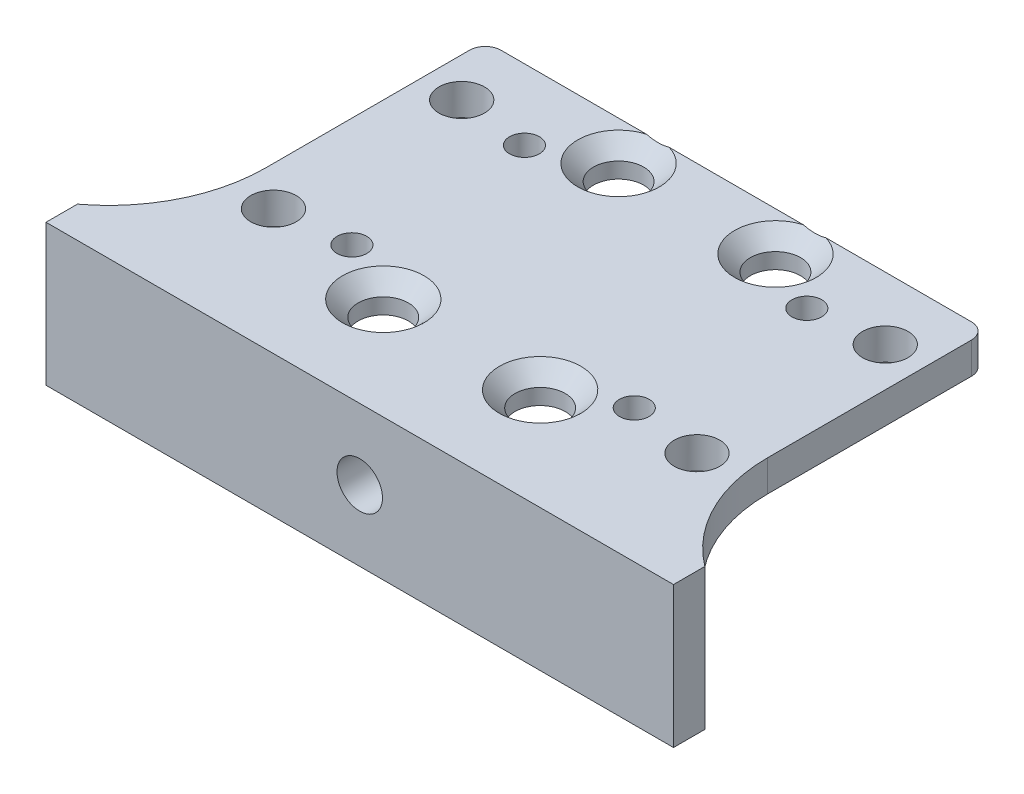
ISO-10303-21;
HEADER;
FILE_DESCRIPTION(('STEP AP214'),'2;1');
FILE_NAME('part.step','',(''),(''),'','','');
FILE_SCHEMA(('AUTOMOTIVE_DESIGN { 1 0 10303 214 1 1 1 1 }'));
ENDSEC;
DATA;
#1=APPLICATION_CONTEXT('core data for automotive mechanical design processes');
#2=APPLICATION_PROTOCOL_DEFINITION('international standard','automotive_design',2000,#1);
#3=PRODUCT_CONTEXT('',#1,'mechanical');
#4=PRODUCT('Part','Part','',(#3));
#5=PRODUCT_RELATED_PRODUCT_CATEGORY('part','',(#4));
#6=PRODUCT_DEFINITION_FORMATION('','',#4);
#7=PRODUCT_DEFINITION_CONTEXT('part definition',#1,'design');
#8=PRODUCT_DEFINITION('design','',#6,#7);
#9=PRODUCT_DEFINITION_SHAPE('','',#8);
#10=(LENGTH_UNIT() NAMED_UNIT(*) SI_UNIT(.MILLI.,.METRE.));
#11=(NAMED_UNIT(*) PLANE_ANGLE_UNIT() SI_UNIT($,.RADIAN.));
#12=(NAMED_UNIT(*) SI_UNIT($,.STERADIAN.) SOLID_ANGLE_UNIT());
#13=UNCERTAINTY_MEASURE_WITH_UNIT(LENGTH_MEASURE(1.E-05),#10,'distance_accuracy_value','');
#14=(GEOMETRIC_REPRESENTATION_CONTEXT(3) GLOBAL_UNCERTAINTY_ASSIGNED_CONTEXT((#13)) GLOBAL_UNIT_ASSIGNED_CONTEXT((#10,
#11,#12)) REPRESENTATION_CONTEXT('',''));
#15=CARTESIAN_POINT('',(0.,0.,0.));
#16=DIRECTION('',(0.,0.,1.));
#17=DIRECTION('',(1.,0.,0.));
#18=AXIS2_PLACEMENT_3D('',#15,#16,#17);
#19=CARTESIAN_POINT('',(-20.,2.,14.));
#20=DIRECTION('',(1.,0.,0.));
#21=DIRECTION('',(0.,0.,-1.));
#22=AXIS2_PLACEMENT_3D('',#19,#20,#21);
#23=PLANE('',#22);
#24=DIRECTION('',(0.,1.,0.));
#25=VECTOR('',#24,1.);
#26=CARTESIAN_POINT('',(-20.,-7.,12.));
#27=LINE('',#26,#25);
#28=CARTESIAN_POINT('',(-20.,-7.,12.));
#29=VERTEX_POINT('',#28);
#30=CARTESIAN_POINT('',(-20.,0.,12.));
#31=VERTEX_POINT('',#30);
#32=EDGE_CURVE('E800',#29,#31,#27,.T.);
#33=ORIENTED_EDGE('',*,*,#32,.F.);
#34=DIRECTION('',(0.,0.,-1.));
#35=VECTOR('',#34,1.);
#36=CARTESIAN_POINT('',(-20.,-7.,14.));
#37=LINE('',#36,#35);
#38=CARTESIAN_POINT('',(-20.,-7.,14.));
#39=VERTEX_POINT('',#38);
#40=EDGE_CURVE('E188',#39,#29,#37,.T.);
#41=ORIENTED_EDGE('',*,*,#40,.F.);
#42=DIRECTION('',(0.,-1.,0.));
#43=VECTOR('',#42,1.);
#44=CARTESIAN_POINT('',(-20.,2.,14.));
#45=LINE('',#44,#43);
#46=CARTESIAN_POINT('',(-20.,2.,14.));
#47=VERTEX_POINT('',#46);
#48=EDGE_CURVE('E847',#47,#39,#45,.T.);
#49=ORIENTED_EDGE('',*,*,#48,.F.);
#50=DIRECTION('',(0.,0.,-1.));
#51=VECTOR('',#50,1.);
#52=CARTESIAN_POINT('',(-20.,2.,14.));
#53=LINE('',#52,#51);
#54=CARTESIAN_POINT('',(-20.,2.,12.));
#55=VERTEX_POINT('',#54);
#56=EDGE_CURVE('E203',#47,#55,#53,.T.);
#57=ORIENTED_EDGE('',*,*,#56,.T.);
#58=EDGE_CURVE('E190',#31,#55,#27,.T.);
#59=ORIENTED_EDGE('',*,*,#58,.F.);
#60=EDGE_LOOP('',(#33,#41,#49,#57,#59));
#61=FACE_BOUND('',#60,.T.);
#62=ADVANCED_FACE('F41',(#61),#23,.F.);
#63=CARTESIAN_POINT('',(-20.,-7.,14.));
#64=DIRECTION('',(0.,1.,0.));
#65=DIRECTION('',(0.,0.,1.));
#66=AXIS2_PLACEMENT_3D('',#63,#64,#65);
#67=PLANE('',#66);
#68=DIRECTION('',(-1.,0.,0.));
#69=VECTOR('',#68,1.);
#70=CARTESIAN_POINT('',(20.,-7.,12.));
#71=LINE('',#70,#69);
#72=CARTESIAN_POINT('',(20.,-7.,12.));
#73=VERTEX_POINT('',#72);
#74=EDGE_CURVE('E167',#73,#29,#71,.T.);
#75=ORIENTED_EDGE('',*,*,#74,.F.);
#76=DIRECTION('',(0.,0.,-1.));
#77=VECTOR('',#76,1.);
#78=CARTESIAN_POINT('',(20.,-7.,14.));
#79=LINE('',#78,#77);
#80=CARTESIAN_POINT('',(20.,-7.,14.));
#81=VERTEX_POINT('',#80);
#82=EDGE_CURVE('E185',#81,#73,#79,.T.);
#83=ORIENTED_EDGE('',*,*,#82,.F.);
#84=DIRECTION('',(1.,0.,0.));
#85=VECTOR('',#84,1.);
#86=CARTESIAN_POINT('',(-20.,-7.,14.));
#87=LINE('',#86,#85);
#88=EDGE_CURVE('E854',#39,#81,#87,.T.);
#89=ORIENTED_EDGE('',*,*,#88,.F.);
#90=ORIENTED_EDGE('',*,*,#40,.T.);
#91=EDGE_LOOP('',(#75,#83,#89,#90));
#92=FACE_BOUND('',#91,.T.);
#93=ADVANCED_FACE('F184',(#92),#67,.F.);
#94=CARTESIAN_POINT('',(20.,2.,14.));
#95=DIRECTION('',(-1.,0.,0.));
#96=DIRECTION('',(0.,0.,1.));
#97=AXIS2_PLACEMENT_3D('',#94,#95,#96);
#98=PLANE('',#97);
#99=DIRECTION('',(0.,-1.,0.));
#100=VECTOR('',#99,1.);
#101=CARTESIAN_POINT('',(20.,2.,12.));
#102=LINE('',#101,#100);
#103=CARTESIAN_POINT('',(20.,2.,12.));
#104=VERTEX_POINT('',#103);
#105=CARTESIAN_POINT('',(20.,0.,12.));
#106=VERTEX_POINT('',#105);
#107=EDGE_CURVE('E178',#104,#106,#102,.T.);
#108=ORIENTED_EDGE('',*,*,#107,.F.);
#109=DIRECTION('',(0.,0.,-1.));
#110=VECTOR('',#109,1.);
#111=CARTESIAN_POINT('',(20.,2.,14.));
#112=LINE('',#111,#110);
#113=CARTESIAN_POINT('',(20.,2.,14.));
#114=VERTEX_POINT('',#113);
#115=EDGE_CURVE('E196',#114,#104,#112,.T.);
#116=ORIENTED_EDGE('',*,*,#115,.F.);
#117=DIRECTION('',(0.,1.,0.));
#118=VECTOR('',#117,1.);
#119=CARTESIAN_POINT('',(20.,2.,14.));
#120=LINE('',#119,#118);
#121=EDGE_CURVE('E194',#81,#114,#120,.T.);
#122=ORIENTED_EDGE('',*,*,#121,.F.);
#123=ORIENTED_EDGE('',*,*,#82,.T.);
#124=EDGE_CURVE('E163',#106,#73,#102,.T.);
#125=ORIENTED_EDGE('',*,*,#124,.F.);
#126=EDGE_LOOP('',(#108,#116,#122,#123,#125));
#127=FACE_BOUND('',#126,.T.);
#128=ADVANCED_FACE('F192',(#127),#98,.F.);
#129=CARTESIAN_POINT('',(0.,2.,0.));
#130=DIRECTION('',(0.,-1.,0.));
#131=DIRECTION('',(0.,0.,-1.));
#132=AXIS2_PLACEMENT_3D('',#129,#130,#131);
#133=PLANE('',#132);
#134=CARTESIAN_POINT('',(-13.5,2.,6.));
#135=DIRECTION('',(0.,1.,0.));
#136=DIRECTION('',(0.,0.,1.));
#137=AXIS2_PLACEMENT_3D('',#134,#135,#136);
#138=CIRCLE('',#137,1.45);
#139=CARTESIAN_POINT('',(-13.5,2.,7.45));
#140=VERTEX_POINT('',#139);
#141=EDGE_CURVE('E767',#140,#140,#138,.T.);
#142=ORIENTED_EDGE('',*,*,#141,.F.);
#143=EDGE_LOOP('',(#142));
#144=FACE_BOUND('',#143,.T.);
#145=CARTESIAN_POINT('',(13.5,2.,6.));
#146=DIRECTION('',(0.,1.,0.));
#147=DIRECTION('',(0.,0.,1.));
#148=AXIS2_PLACEMENT_3D('',#145,#146,#147);
#149=CIRCLE('',#148,1.45);
#150=CARTESIAN_POINT('',(13.5,2.,7.45));
#151=VERTEX_POINT('',#150);
#152=EDGE_CURVE('E773',#151,#151,#149,.T.);
#153=ORIENTED_EDGE('',*,*,#152,.F.);
#154=EDGE_LOOP('',(#153));
#155=FACE_BOUND('',#154,.T.);
#156=CARTESIAN_POINT('',(13.5,2.,-6.));
#157=DIRECTION('',(0.,1.,0.));
#158=DIRECTION('',(0.,0.,1.));
#159=AXIS2_PLACEMENT_3D('',#156,#157,#158);
#160=CIRCLE('',#159,1.45);
#161=CARTESIAN_POINT('',(13.5,2.,-4.55));
#162=VERTEX_POINT('',#161);
#163=EDGE_CURVE('E779',#162,#162,#160,.T.);
#164=ORIENTED_EDGE('',*,*,#163,.F.);
#165=EDGE_LOOP('',(#164));
#166=FACE_BOUND('',#165,.T.);
#167=CARTESIAN_POINT('',(-9.,2.,-5.5));
#168=DIRECTION('',(0.,1.,0.));
#169=DIRECTION('',(0.,0.,1.));
#170=AXIS2_PLACEMENT_3D('',#167,#168,#169);
#171=CIRCLE('',#170,0.949999999999999);
#172=CARTESIAN_POINT('',(-9.,2.,-4.55));
#173=VERTEX_POINT('',#172);
#174=EDGE_CURVE('E785',#173,#173,#171,.T.);
#175=ORIENTED_EDGE('',*,*,#174,.F.);
#176=EDGE_LOOP('',(#175));
#177=FACE_BOUND('',#176,.T.);
#178=CARTESIAN_POINT('',(9.,2.,-5.5));
#179=DIRECTION('',(0.,1.,0.));
#180=DIRECTION('',(0.,0.,1.));
#181=AXIS2_PLACEMENT_3D('',#178,#179,#180);
#182=CIRCLE('',#181,0.949999999999999);
#183=CARTESIAN_POINT('',(9.,2.,-4.55));
#184=VERTEX_POINT('',#183);
#185=EDGE_CURVE('E791',#184,#184,#182,.T.);
#186=ORIENTED_EDGE('',*,*,#185,.F.);
#187=EDGE_LOOP('',(#186));
#188=FACE_BOUND('',#187,.T.);
#189=CARTESIAN_POINT('',(9.,2.,5.5));
#190=DIRECTION('',(0.,1.,0.));
#191=DIRECTION('',(0.,0.,1.));
#192=AXIS2_PLACEMENT_3D('',#189,#190,#191);
#193=CIRCLE('',#192,0.949999999999999);
#194=CARTESIAN_POINT('',(9.,2.,6.45));
#195=VERTEX_POINT('',#194);
#196=EDGE_CURVE('E762',#195,#195,#193,.T.);
#197=ORIENTED_EDGE('',*,*,#196,.F.);
#198=EDGE_LOOP('',(#197));
#199=FACE_BOUND('',#198,.T.);
#200=CARTESIAN_POINT('',(-9.,2.,5.5));
#201=DIRECTION('',(0.,1.,0.));
#202=DIRECTION('',(0.,0.,1.));
#203=AXIS2_PLACEMENT_3D('',#200,#201,#202);
#204=CIRCLE('',#203,0.949999999999999);
#205=CARTESIAN_POINT('',(-9.,2.,6.45));
#206=VERTEX_POINT('',#205);
#207=EDGE_CURVE('E756',#206,#206,#204,.T.);
#208=ORIENTED_EDGE('',*,*,#207,.F.);
#209=EDGE_LOOP('',(#208));
#210=FACE_BOUND('',#209,.T.);
#211=CARTESIAN_POINT('',(-13.5,2.,-6.));
#212=DIRECTION('',(0.,1.,0.));
#213=DIRECTION('',(0.,0.,1.));
#214=AXIS2_PLACEMENT_3D('',#211,#212,#213);
#215=CIRCLE('',#214,1.45);
#216=CARTESIAN_POINT('',(-13.5,2.,-4.55));
#217=VERTEX_POINT('',#216);
#218=EDGE_CURVE('E792',#217,#217,#215,.T.);
#219=ORIENTED_EDGE('',*,*,#218,.F.);
#220=EDGE_LOOP('',(#219));
#221=FACE_BOUND('',#220,.T.);
#222=CARTESIAN_POINT('',(-5.,2.,7.5));
#223=DIRECTION('',(0.,-1.,0.));
#224=DIRECTION('',(0.,0.,-1.));
#225=AXIS2_PLACEMENT_3D('',#222,#223,#224);
#226=CIRCLE('',#225,2.60000000000002);
#227=CARTESIAN_POINT('',(-5.,2.,4.89999999999998));
#228=VERTEX_POINT('',#227);
#229=EDGE_CURVE('E283',#228,#228,#226,.T.);
#230=ORIENTED_EDGE('',*,*,#229,.T.);
#231=EDGE_LOOP('',(#230));
#232=FACE_BOUND('',#231,.T.);
#233=CARTESIAN_POINT('',(5.,2.,7.5));
#234=DIRECTION('',(0.,-1.,0.));
#235=DIRECTION('',(0.,0.,-1.));
#236=AXIS2_PLACEMENT_3D('',#233,#234,#235);
#237=CIRCLE('',#236,2.60000000000002);
#238=CARTESIAN_POINT('',(5.,2.,4.89999999999998));
#239=VERTEX_POINT('',#238);
#240=EDGE_CURVE('E279',#239,#239,#237,.T.);
#241=ORIENTED_EDGE('',*,*,#240,.T.);
#242=EDGE_LOOP('',(#241));
#243=FACE_BOUND('',#242,.T.);
#244=DIRECTION('',(0.,0.,-1.));
#245=VECTOR('',#244,1.);
#246=CARTESIAN_POINT('',(16.,2.,10.));
#247=LINE('',#246,#245);
#248=CARTESIAN_POINT('',(16.,2.,4.));
#249=VERTEX_POINT('',#248);
#250=CARTESIAN_POINT('',(16.,2.,-9.));
#251=VERTEX_POINT('',#250);
#252=EDGE_CURVE('E223',#249,#251,#247,.T.);
#253=ORIENTED_EDGE('',*,*,#252,.T.);
#254=CARTESIAN_POINT('',(15.,2.,-9.));
#255=DIRECTION('',(0.,-1.,0.));
#256=DIRECTION('',(0.,0.,-1.));
#257=AXIS2_PLACEMENT_3D('',#254,#255,#256);
#258=CIRCLE('',#257,1.);
#259=CARTESIAN_POINT('',(15.,2.,-10.));
#260=VERTEX_POINT('',#259);
#261=EDGE_CURVE('E50',#251,#260,#258,.F.);
#262=ORIENTED_EDGE('',*,*,#261,.T.);
#263=DIRECTION('',(-1.,0.,0.));
#264=VECTOR('',#263,1.);
#265=CARTESIAN_POINT('',(-16.,2.,-10.));
#266=LINE('',#265,#264);
#267=CARTESIAN_POINT('',(5.71414284285432,2.,-10.));
#268=VERTEX_POINT('',#267);
#269=EDGE_CURVE('E228',#260,#268,#266,.T.);
#270=ORIENTED_EDGE('',*,*,#269,.T.);
#271=CARTESIAN_POINT('',(5.,2.,-7.5));
#272=DIRECTION('',(0.,-1.,0.));
#273=DIRECTION('',(0.,0.,-1.));
#274=AXIS2_PLACEMENT_3D('',#271,#272,#273);
#275=CIRCLE('',#274,2.60000000000001);
#276=CARTESIAN_POINT('',(4.28585715714569,2.,-10.));
#277=VERTEX_POINT('',#276);
#278=EDGE_CURVE('E275',#268,#277,#275,.T.);
#279=ORIENTED_EDGE('',*,*,#278,.T.);
#280=CARTESIAN_POINT('',(-4.28585715714569,2.,-10.));
#281=VERTEX_POINT('',#280);
#282=EDGE_CURVE('E232',#277,#281,#266,.T.);
#283=ORIENTED_EDGE('',*,*,#282,.T.);
#284=CARTESIAN_POINT('',(-5.,2.,-7.5));
#285=DIRECTION('',(0.,-1.,0.));
#286=DIRECTION('',(0.,0.,-1.));
#287=AXIS2_PLACEMENT_3D('',#284,#285,#286);
#288=CIRCLE('',#287,2.60000000000001);
#289=CARTESIAN_POINT('',(-5.71414284285431,2.,-10.));
#290=VERTEX_POINT('',#289);
#291=EDGE_CURVE('E271',#281,#290,#288,.T.);
#292=ORIENTED_EDGE('',*,*,#291,.T.);
#293=CARTESIAN_POINT('',(-15.,2.,-10.));
#294=VERTEX_POINT('',#293);
#295=EDGE_CURVE('E226',#290,#294,#266,.T.);
#296=ORIENTED_EDGE('',*,*,#295,.T.);
#297=CARTESIAN_POINT('',(-15.,2.,-9.));
#298=DIRECTION('',(0.,-1.,0.));
#299=DIRECTION('',(0.,0.,-1.));
#300=AXIS2_PLACEMENT_3D('',#297,#298,#299);
#301=CIRCLE('',#300,1.);
#302=CARTESIAN_POINT('',(-16.,2.,-9.));
#303=VERTEX_POINT('',#302);
#304=EDGE_CURVE('E57',#294,#303,#301,.F.);
#305=ORIENTED_EDGE('',*,*,#304,.T.);
#306=DIRECTION('',(0.,0.,1.));
#307=VECTOR('',#306,1.);
#308=CARTESIAN_POINT('',(-16.,2.,10.));
#309=LINE('',#308,#307);
#310=CARTESIAN_POINT('',(-16.,2.,4.));
#311=VERTEX_POINT('',#310);
#312=EDGE_CURVE('E231',#303,#311,#309,.T.);
#313=ORIENTED_EDGE('',*,*,#312,.T.);
#314=CARTESIAN_POINT('',(-26.,2.,4.));
#315=DIRECTION('',(0.,-1.,0.));
#316=DIRECTION('',(0.,0.,-1.));
#317=AXIS2_PLACEMENT_3D('',#314,#315,#316);
#318=CIRCLE('',#317,10.);
#319=EDGE_CURVE('E264',#311,#55,#318,.T.);
#320=ORIENTED_EDGE('',*,*,#319,.T.);
#321=ORIENTED_EDGE('',*,*,#56,.F.);
#322=DIRECTION('',(-1.,0.,0.));
#323=VECTOR('',#322,1.);
#324=CARTESIAN_POINT('',(-20.,2.,14.));
#325=LINE('',#324,#323);
#326=EDGE_CURVE('E859',#114,#47,#325,.T.);
#327=ORIENTED_EDGE('',*,*,#326,.F.);
#328=ORIENTED_EDGE('',*,*,#115,.T.);
#329=CARTESIAN_POINT('',(26.,2.,4.));
#330=DIRECTION('',(0.,-1.,0.));
#331=DIRECTION('',(0.,0.,-1.));
#332=AXIS2_PLACEMENT_3D('',#329,#330,#331);
#333=CIRCLE('',#332,10.);
#334=EDGE_CURVE('E254',#104,#249,#333,.T.);
#335=ORIENTED_EDGE('',*,*,#334,.T.);
#336=EDGE_LOOP('',(#253,#262,#270,#279,#283,#292,#296,#305,#313,#320,#321,#327,#328,#335));
#337=FACE_BOUND('',#336,.T.);
#338=ADVANCED_FACE('F387',(#144,#155,#166,#177,#188,#199,#210,#221,#232,#243,#337),#133,.F.);
#339=CARTESIAN_POINT('',(0.,0.,0.));
#340=DIRECTION('',(0.,-1.,0.));
#341=DIRECTION('',(0.,0.,-1.));
#342=AXIS2_PLACEMENT_3D('',#339,#340,#341);
#343=PLANE('',#342);
#344=CARTESIAN_POINT('',(-13.5,0.,6.));
#345=DIRECTION('',(0.,-1.,0.));
#346=DIRECTION('',(0.,0.,-1.));
#347=AXIS2_PLACEMENT_3D('',#344,#345,#346);
#348=CIRCLE('',#347,1.45);
#349=CARTESIAN_POINT('',(-13.5,0.,4.55));
#350=VERTEX_POINT('',#349);
#351=EDGE_CURVE('E397',#350,#350,#348,.F.);
#352=ORIENTED_EDGE('',*,*,#351,.T.);
#353=EDGE_LOOP('',(#352));
#354=FACE_BOUND('',#353,.T.);
#355=CARTESIAN_POINT('',(13.5,0.,6.));
#356=DIRECTION('',(0.,-1.,0.));
#357=DIRECTION('',(0.,0.,-1.));
#358=AXIS2_PLACEMENT_3D('',#355,#356,#357);
#359=CIRCLE('',#358,1.45);
#360=CARTESIAN_POINT('',(13.5,0.,4.55));
#361=VERTEX_POINT('',#360);
#362=EDGE_CURVE('E401',#361,#361,#359,.F.);
#363=ORIENTED_EDGE('',*,*,#362,.T.);
#364=EDGE_LOOP('',(#363));
#365=FACE_BOUND('',#364,.T.);
#366=CARTESIAN_POINT('',(13.5,0.,-6.));
#367=DIRECTION('',(0.,-1.,0.));
#368=DIRECTION('',(0.,0.,-1.));
#369=AXIS2_PLACEMENT_3D('',#366,#367,#368);
#370=CIRCLE('',#369,1.45);
#371=CARTESIAN_POINT('',(13.5,0.,-7.45));
#372=VERTEX_POINT('',#371);
#373=EDGE_CURVE('E405',#372,#372,#370,.F.);
#374=ORIENTED_EDGE('',*,*,#373,.T.);
#375=EDGE_LOOP('',(#374));
#376=FACE_BOUND('',#375,.T.);
#377=CARTESIAN_POINT('',(-9.,0.,-5.5));
#378=DIRECTION('',(0.,-1.,0.));
#379=DIRECTION('',(0.,0.,-1.));
#380=AXIS2_PLACEMENT_3D('',#377,#378,#379);
#381=CIRCLE('',#380,0.949999999999999);
#382=CARTESIAN_POINT('',(-9.,0.,-6.45));
#383=VERTEX_POINT('',#382);
#384=EDGE_CURVE('E409',#383,#383,#381,.F.);
#385=ORIENTED_EDGE('',*,*,#384,.T.);
#386=EDGE_LOOP('',(#385));
#387=FACE_BOUND('',#386,.T.);
#388=CARTESIAN_POINT('',(9.,0.,-5.5));
#389=DIRECTION('',(0.,-1.,0.));
#390=DIRECTION('',(0.,0.,-1.));
#391=AXIS2_PLACEMENT_3D('',#388,#389,#390);
#392=CIRCLE('',#391,0.949999999999999);
#393=CARTESIAN_POINT('',(9.,0.,-6.45));
#394=VERTEX_POINT('',#393);
#395=EDGE_CURVE('E413',#394,#394,#392,.F.);
#396=ORIENTED_EDGE('',*,*,#395,.T.);
#397=EDGE_LOOP('',(#396));
#398=FACE_BOUND('',#397,.T.);
#399=CARTESIAN_POINT('',(9.,0.,5.5));
#400=DIRECTION('',(0.,-1.,0.));
#401=DIRECTION('',(0.,0.,-1.));
#402=AXIS2_PLACEMENT_3D('',#399,#400,#401);
#403=CIRCLE('',#402,0.949999999999999);
#404=CARTESIAN_POINT('',(9.,0.,4.55));
#405=VERTEX_POINT('',#404);
#406=EDGE_CURVE('E417',#405,#405,#403,.F.);
#407=ORIENTED_EDGE('',*,*,#406,.T.);
#408=EDGE_LOOP('',(#407));
#409=FACE_BOUND('',#408,.T.);
#410=CARTESIAN_POINT('',(-9.,0.,5.5));
#411=DIRECTION('',(0.,-1.,0.));
#412=DIRECTION('',(0.,0.,-1.));
#413=AXIS2_PLACEMENT_3D('',#410,#411,#412);
#414=CIRCLE('',#413,0.949999999999999);
#415=CARTESIAN_POINT('',(-9.,0.,4.55));
#416=VERTEX_POINT('',#415);
#417=EDGE_CURVE('E421',#416,#416,#414,.F.);
#418=ORIENTED_EDGE('',*,*,#417,.T.);
#419=EDGE_LOOP('',(#418));
#420=FACE_BOUND('',#419,.T.);
#421=CARTESIAN_POINT('',(-13.5,0.,-6.));
#422=DIRECTION('',(0.,-1.,0.));
#423=DIRECTION('',(0.,0.,-1.));
#424=AXIS2_PLACEMENT_3D('',#421,#422,#423);
#425=CIRCLE('',#424,1.45);
#426=CARTESIAN_POINT('',(-13.5,0.,-7.45));
#427=VERTEX_POINT('',#426);
#428=EDGE_CURVE('E425',#427,#427,#425,.F.);
#429=ORIENTED_EDGE('',*,*,#428,.T.);
#430=EDGE_LOOP('',(#429));
#431=FACE_BOUND('',#430,.T.);
#432=CARTESIAN_POINT('',(-5.,0.,7.5));
#433=DIRECTION('',(0.,1.,0.));
#434=DIRECTION('',(0.,0.,1.));
#435=AXIS2_PLACEMENT_3D('',#432,#433,#434);
#436=CIRCLE('',#435,1.6);
#437=CARTESIAN_POINT('',(-5.,0.,9.1));
#438=VERTEX_POINT('',#437);
#439=EDGE_CURVE('E210',#438,#438,#436,.T.);
#440=ORIENTED_EDGE('',*,*,#439,.T.);
#441=EDGE_LOOP('',(#440));
#442=FACE_BOUND('',#441,.T.);
#443=CARTESIAN_POINT('',(-5.,0.,-7.5));
#444=DIRECTION('',(0.,1.,0.));
#445=DIRECTION('',(0.,0.,1.));
#446=AXIS2_PLACEMENT_3D('',#443,#444,#445);
#447=CIRCLE('',#446,1.6);
#448=CARTESIAN_POINT('',(-5.,0.,-5.9));
#449=VERTEX_POINT('',#448);
#450=EDGE_CURVE('E218',#449,#449,#447,.T.);
#451=ORIENTED_EDGE('',*,*,#450,.T.);
#452=EDGE_LOOP('',(#451));
#453=FACE_BOUND('',#452,.T.);
#454=DIRECTION('',(-1.,0.,0.));
#455=VECTOR('',#454,1.);
#456=CARTESIAN_POINT('',(-16.,0.,-10.));
#457=LINE('',#456,#455);
#458=CARTESIAN_POINT('',(15.,0.,-10.));
#459=VERTEX_POINT('',#458);
#460=CARTESIAN_POINT('',(-15.,0.,-10.));
#461=VERTEX_POINT('',#460);
#462=EDGE_CURVE('E238',#459,#461,#457,.T.);
#463=ORIENTED_EDGE('',*,*,#462,.F.);
#464=CARTESIAN_POINT('',(15.,0.,-9.));
#465=DIRECTION('',(0.,-1.,0.));
#466=DIRECTION('',(0.,0.,-1.));
#467=AXIS2_PLACEMENT_3D('',#464,#465,#466);
#468=CIRCLE('',#467,1.);
#469=CARTESIAN_POINT('',(16.,0.,-9.));
#470=VERTEX_POINT('',#469);
#471=EDGE_CURVE('E438',#459,#470,#468,.T.);
#472=ORIENTED_EDGE('',*,*,#471,.T.);
#473=DIRECTION('',(0.,0.,-1.));
#474=VECTOR('',#473,1.);
#475=CARTESIAN_POINT('',(16.,0.,10.));
#476=LINE('',#475,#474);
#477=CARTESIAN_POINT('',(16.,0.,4.));
#478=VERTEX_POINT('',#477);
#479=EDGE_CURVE('E222',#478,#470,#476,.T.);
#480=ORIENTED_EDGE('',*,*,#479,.F.);
#481=CARTESIAN_POINT('',(26.,0.,4.));
#482=DIRECTION('',(0.,-1.,0.));
#483=DIRECTION('',(0.,0.,-1.));
#484=AXIS2_PLACEMENT_3D('',#481,#482,#483);
#485=CIRCLE('',#484,10.);
#486=EDGE_CURVE('E257',#478,#106,#485,.F.);
#487=ORIENTED_EDGE('',*,*,#486,.T.);
#488=DIRECTION('',(1.,0.,0.));
#489=VECTOR('',#488,1.);
#490=CARTESIAN_POINT('',(16.,0.,12.));
#491=LINE('',#490,#489);
#492=CARTESIAN_POINT('',(4.,0.,12.));
#493=VERTEX_POINT('',#492);
#494=EDGE_CURVE('E171',#493,#106,#491,.T.);
#495=ORIENTED_EDGE('',*,*,#494,.F.);
#496=DIRECTION('',(0.,0.,-1.));
#497=VECTOR('',#496,1.);
#498=CARTESIAN_POINT('',(4.,0.,12.));
#499=LINE('',#498,#497);
#500=CARTESIAN_POINT('',(4.,0.,10.));
#501=VERTEX_POINT('',#500);
#502=EDGE_CURVE('E831',#493,#501,#499,.T.);
#503=ORIENTED_EDGE('',*,*,#502,.T.);
#504=DIRECTION('',(1.,0.,0.));
#505=VECTOR('',#504,1.);
#506=CARTESIAN_POINT('',(-16.,0.,10.));
#507=LINE('',#506,#505);
#508=CARTESIAN_POINT('',(-4.,0.,10.));
#509=VERTEX_POINT('',#508);
#510=EDGE_CURVE('E227',#509,#501,#507,.T.);
#511=ORIENTED_EDGE('',*,*,#510,.F.);
#512=DIRECTION('',(0.,0.,-1.));
#513=VECTOR('',#512,1.);
#514=CARTESIAN_POINT('',(-4.,0.,12.));
#515=LINE('',#514,#513);
#516=CARTESIAN_POINT('',(-4.,0.,12.));
#517=VERTEX_POINT('',#516);
#518=EDGE_CURVE('E820',#517,#509,#515,.T.);
#519=ORIENTED_EDGE('',*,*,#518,.F.);
#520=DIRECTION('',(1.,0.,0.));
#521=VECTOR('',#520,1.);
#522=CARTESIAN_POINT('',(-16.,0.,12.));
#523=LINE('',#522,#521);
#524=EDGE_CURVE('E803',#31,#517,#523,.T.);
#525=ORIENTED_EDGE('',*,*,#524,.F.);
#526=CARTESIAN_POINT('',(-26.,0.,4.));
#527=DIRECTION('',(0.,-1.,0.));
#528=DIRECTION('',(0.,0.,-1.));
#529=AXIS2_PLACEMENT_3D('',#526,#527,#528);
#530=CIRCLE('',#529,10.);
#531=CARTESIAN_POINT('',(-16.,0.,4.));
#532=VERTEX_POINT('',#531);
#533=EDGE_CURVE('E260',#31,#532,#530,.F.);
#534=ORIENTED_EDGE('',*,*,#533,.T.);
#535=DIRECTION('',(0.,0.,1.));
#536=VECTOR('',#535,1.);
#537=CARTESIAN_POINT('',(-16.,0.,10.));
#538=LINE('',#537,#536);
#539=CARTESIAN_POINT('',(-16.,0.,-9.));
#540=VERTEX_POINT('',#539);
#541=EDGE_CURVE('E242',#540,#532,#538,.T.);
#542=ORIENTED_EDGE('',*,*,#541,.F.);
#543=CARTESIAN_POINT('',(-15.,0.,-9.));
#544=DIRECTION('',(0.,-1.,0.));
#545=DIRECTION('',(0.,0.,-1.));
#546=AXIS2_PLACEMENT_3D('',#543,#544,#545);
#547=CIRCLE('',#546,1.);
#548=EDGE_CURVE('E440',#540,#461,#547,.T.);
#549=ORIENTED_EDGE('',*,*,#548,.T.);
#550=EDGE_LOOP('',(#463,#472,#480,#487,#495,#503,#511,#519,#525,#534,#542,#549));
#551=FACE_BOUND('',#550,.T.);
#552=CARTESIAN_POINT('',(5.,0.,-7.5));
#553=DIRECTION('',(0.,1.,0.));
#554=DIRECTION('',(0.,0.,1.));
#555=AXIS2_PLACEMENT_3D('',#552,#553,#554);
#556=CIRCLE('',#555,1.6);
#557=CARTESIAN_POINT('',(5.,0.,-5.9));
#558=VERTEX_POINT('',#557);
#559=EDGE_CURVE('E214',#558,#558,#556,.T.);
#560=ORIENTED_EDGE('',*,*,#559,.T.);
#561=EDGE_LOOP('',(#560));
#562=FACE_BOUND('',#561,.T.);
#563=CARTESIAN_POINT('',(5.,0.,7.5));
#564=DIRECTION('',(0.,1.,0.));
#565=DIRECTION('',(0.,0.,1.));
#566=AXIS2_PLACEMENT_3D('',#563,#564,#565);
#567=CIRCLE('',#566,1.6);
#568=CARTESIAN_POINT('',(5.,0.,9.1));
#569=VERTEX_POINT('',#568);
#570=EDGE_CURVE('E200',#569,#569,#567,.T.);
#571=ORIENTED_EDGE('',*,*,#570,.T.);
#572=EDGE_LOOP('',(#571));
#573=FACE_BOUND('',#572,.T.);
#574=ADVANCED_FACE('F326',(#354,#365,#376,#387,#398,#409,#420,#431,#442,#453,#551,#562,#573),
#343,.T.);
#575=CARTESIAN_POINT('',(16.,2.,10.));
#576=DIRECTION('',(-1.,0.,0.));
#577=DIRECTION('',(0.,0.,1.));
#578=AXIS2_PLACEMENT_3D('',#575,#576,#577);
#579=PLANE('',#578);
#580=ORIENTED_EDGE('',*,*,#479,.T.);
#581=DIRECTION('',(0.,-1.,0.));
#582=VECTOR('',#581,1.);
#583=CARTESIAN_POINT('',(16.,2.,-9.));
#584=LINE('',#583,#582);
#585=EDGE_CURVE('E65',#470,#251,#584,.F.);
#586=ORIENTED_EDGE('',*,*,#585,.T.);
#587=ORIENTED_EDGE('',*,*,#252,.F.);
#588=DIRECTION('',(0.,1.,0.));
#589=VECTOR('',#588,1.);
#590=CARTESIAN_POINT('',(16.,2.,4.));
#591=LINE('',#590,#589);
#592=EDGE_CURVE('E235',#249,#478,#591,.F.);
#593=ORIENTED_EDGE('',*,*,#592,.T.);
#594=EDGE_LOOP('',(#580,#586,#587,#593));
#595=FACE_BOUND('',#594,.T.);
#596=ADVANCED_FACE('F320',(#595),#579,.F.);
#597=CARTESIAN_POINT('',(-16.,2.,-10.));
#598=DIRECTION('',(0.,0.,1.));
#599=DIRECTION('',(1.,0.,0.));
#600=AXIS2_PLACEMENT_3D('',#597,#598,#599);
#601=PLANE('',#600);
#602=ORIENTED_EDGE('',*,*,#269,.F.);
#603=DIRECTION('',(0.,-1.,0.));
#604=VECTOR('',#603,1.);
#605=CARTESIAN_POINT('',(15.,2.,-10.));
#606=LINE('',#605,#604);
#607=EDGE_CURVE('E447',#260,#459,#606,.T.);
#608=ORIENTED_EDGE('',*,*,#607,.T.);
#609=ORIENTED_EDGE('',*,*,#462,.T.);
#610=DIRECTION('',(0.,-1.,0.));
#611=VECTOR('',#610,1.);
#612=CARTESIAN_POINT('',(-15.,2.,-10.));
#613=LINE('',#612,#611);
#614=EDGE_CURVE('E445',#461,#294,#613,.F.);
#615=ORIENTED_EDGE('',*,*,#614,.T.);
#616=ORIENTED_EDGE('',*,*,#295,.F.);
#617=CARTESIAN_POINT('',(-5.71414284285431,2.,-10.));
#618=CARTESIAN_POINT('',(-5.65156144485252,1.98279216688061,-10.));
#619=CARTESIAN_POINT('',(-5.58841113064282,1.96755299884753,-10.));
#620=CARTESIAN_POINT('',(-5.4611674260889,1.94142098615718,-10.));
#621=CARTESIAN_POINT('',(-5.39707330086993,1.93053173664373,-10.));
#622=CARTESIAN_POINT('',(-5.26954474394316,1.91371032546571,-10.));
#623=CARTESIAN_POINT('',(-5.20612322210676,1.90768228055085,-10.));
#624=CARTESIAN_POINT('',(-5.07904488916608,1.90044320306248,-10.));
#625=CARTESIAN_POINT('',(-5.01538819999165,1.8992299514041,-10.));
#626=CARTESIAN_POINT('',(-4.84029594757232,1.90262959530676,-10.));
#627=CARTESIAN_POINT('',(-4.72891076847059,1.91230697717625,-10.));
#628=CARTESIAN_POINT('',(-4.56252150504388,1.93737434116588,-10.));
#629=CARTESIAN_POINT('',(-4.50666580182846,1.94763253726078,-10.));
#630=CARTESIAN_POINT('',(-4.39569145672585,1.97143178889876,-10.));
#631=CARTESIAN_POINT('',(-4.34057238127652,1.98497081472162,-10.));
#632=CARTESIAN_POINT('',(-4.28585715714569,2.,-10.));
#633=B_SPLINE_CURVE_WITH_KNOTS('',3,(#617,#618,#619,#620,#621,#622,#623,#624,#625,#626,#627,
#628,#629,#630,#631,#632),.UNSPECIFIED.,.F.,.F.,(4,2,2,2,2,2,2,4),(0.,0.194719759098642,
0.389600119899326,0.580535556078681,0.771382982004305,1.10567595081883,1.27596586246089,
1.44615069020363),.UNSPECIFIED.);
#634=EDGE_CURVE('E295',#290,#281,#633,.T.);
#635=ORIENTED_EDGE('',*,*,#634,.T.);
#636=ORIENTED_EDGE('',*,*,#282,.F.);
#637=CARTESIAN_POINT('',(4.28585715714569,2.,-10.));
#638=CARTESIAN_POINT('',(4.34843855514747,1.98279216688061,-10.));
#639=CARTESIAN_POINT('',(4.41158886935718,1.96755299884753,-10.));
#640=CARTESIAN_POINT('',(4.53883257391109,1.94142098615718,-10.));
#641=CARTESIAN_POINT('',(4.60292669913006,1.93053173664373,-10.));
#642=CARTESIAN_POINT('',(4.73045525605683,1.91371032546571,-10.));
#643=CARTESIAN_POINT('',(4.79387677789323,1.90768228055085,-10.));
#644=CARTESIAN_POINT('',(4.92095511083392,1.90044320306247,-10.));
#645=CARTESIAN_POINT('',(4.98461180000834,1.8992299514041,-10.));
#646=CARTESIAN_POINT('',(5.15970405242767,1.90262959530676,-10.));
#647=CARTESIAN_POINT('',(5.27108923152941,1.91230697717625,-10.));
#648=CARTESIAN_POINT('',(5.43747849495612,1.93737434116588,-10.));
#649=CARTESIAN_POINT('',(5.49333419817154,1.94763253726078,-10.));
#650=CARTESIAN_POINT('',(5.60430854327416,1.97143178889876,-10.));
#651=CARTESIAN_POINT('',(5.65942761872349,1.98497081472162,-10.));
#652=CARTESIAN_POINT('',(5.71414284285432,2.,-10.));
#653=B_SPLINE_CURVE_WITH_KNOTS('',3,(#637,#638,#639,#640,#641,#642,#643,#644,#645,#646,#647,
#648,#649,#650,#651,#652),.UNSPECIFIED.,.F.,.F.,(4,2,2,2,2,2,2,4),(0.,0.194719759098643,
0.389600119899326,0.580535556078682,0.771382982004305,1.10567595081884,1.2759658624609,
1.44615069020364),.UNSPECIFIED.);
#654=EDGE_CURVE('E304',#277,#268,#653,.T.);
#655=ORIENTED_EDGE('',*,*,#654,.T.);
#656=EDGE_LOOP('',(#602,#608,#609,#615,#616,#635,#636,#655));
#657=FACE_BOUND('',#656,.T.);
#658=ADVANCED_FACE('F314',(#657),#601,.F.);
#659=CARTESIAN_POINT('',(-16.,2.,10.));
#660=DIRECTION('',(1.,0.,0.));
#661=DIRECTION('',(0.,0.,-1.));
#662=AXIS2_PLACEMENT_3D('',#659,#660,#661);
#663=PLANE('',#662);
#664=ORIENTED_EDGE('',*,*,#312,.F.);
#665=DIRECTION('',(0.,-1.,0.));
#666=VECTOR('',#665,1.);
#667=CARTESIAN_POINT('',(-16.,2.,-9.));
#668=LINE('',#667,#666);
#669=EDGE_CURVE('E11',#303,#540,#668,.T.);
#670=ORIENTED_EDGE('',*,*,#669,.T.);
#671=ORIENTED_EDGE('',*,*,#541,.T.);
#672=DIRECTION('',(0.,-1.,0.));
#673=VECTOR('',#672,1.);
#674=CARTESIAN_POINT('',(-16.,2.,4.));
#675=LINE('',#674,#673);
#676=EDGE_CURVE('E250',#532,#311,#675,.F.);
#677=ORIENTED_EDGE('',*,*,#676,.T.);
#678=EDGE_LOOP('',(#664,#670,#671,#677));
#679=FACE_BOUND('',#678,.T.);
#680=ADVANCED_FACE('F319',(#679),#663,.F.);
#681=CARTESIAN_POINT('',(-5.,2.,-7.5));
#682=DIRECTION('',(0.,-1.,0.));
#683=DIRECTION('',(0.,0.,-1.));
#684=AXIS2_PLACEMENT_3D('',#681,#682,#683);
#685=CYLINDRICAL_SURFACE('',#684,1.6);
#686=CARTESIAN_POINT('',(-5.,0.999999999999982,-7.5));
#687=DIRECTION('',(0.,-1.,0.));
#688=DIRECTION('',(0.,0.,-1.));
#689=AXIS2_PLACEMENT_3D('',#686,#687,#688);
#690=CIRCLE('',#689,1.6);
#691=CARTESIAN_POINT('',(-5.,0.999999999999982,-9.1));
#692=VERTEX_POINT('',#691);
#693=EDGE_CURVE('E451',#692,#692,#690,.F.);
#694=ORIENTED_EDGE('',*,*,#693,.T.);
#695=EDGE_LOOP('',(#694));
#696=FACE_BOUND('',#695,.T.);
#697=ORIENTED_EDGE('',*,*,#450,.F.);
#698=EDGE_LOOP('',(#697));
#699=FACE_BOUND('',#698,.T.);
#700=ADVANCED_FACE('F382',(#696,#699),#685,.F.);
#701=CARTESIAN_POINT('',(5.,2.,-7.5));
#702=DIRECTION('',(0.,-1.,0.));
#703=DIRECTION('',(0.,0.,-1.));
#704=AXIS2_PLACEMENT_3D('',#701,#702,#703);
#705=CYLINDRICAL_SURFACE('',#704,1.6);
#706=CARTESIAN_POINT('',(5.,0.999999999999982,-7.5));
#707=DIRECTION('',(0.,-1.,0.));
#708=DIRECTION('',(0.,0.,-1.));
#709=AXIS2_PLACEMENT_3D('',#706,#707,#708);
#710=CIRCLE('',#709,1.6);
#711=CARTESIAN_POINT('',(5.,0.999999999999982,-9.1));
#712=VERTEX_POINT('',#711);
#713=EDGE_CURVE('E291',#712,#712,#710,.F.);
#714=ORIENTED_EDGE('',*,*,#713,.T.);
#715=EDGE_LOOP('',(#714));
#716=FACE_BOUND('',#715,.T.);
#717=ORIENTED_EDGE('',*,*,#559,.F.);
#718=EDGE_LOOP('',(#717));
#719=FACE_BOUND('',#718,.T.);
#720=ADVANCED_FACE('F378',(#716,#719),#705,.F.);
#721=CARTESIAN_POINT('',(-5.,2.,7.5));
#722=DIRECTION('',(0.,-1.,0.));
#723=DIRECTION('',(0.,0.,-1.));
#724=AXIS2_PLACEMENT_3D('',#721,#722,#723);
#725=CYLINDRICAL_SURFACE('',#724,1.6);
#726=CARTESIAN_POINT('',(-5.,0.999999999999982,7.5));
#727=DIRECTION('',(0.,-1.,0.));
#728=DIRECTION('',(0.,0.,-1.));
#729=AXIS2_PLACEMENT_3D('',#726,#727,#728);
#730=CIRCLE('',#729,1.6);
#731=CARTESIAN_POINT('',(-5.,0.999999999999982,5.9));
#732=VERTEX_POINT('',#731);
#733=EDGE_CURVE('E267',#732,#732,#730,.F.);
#734=ORIENTED_EDGE('',*,*,#733,.T.);
#735=EDGE_LOOP('',(#734));
#736=FACE_BOUND('',#735,.T.);
#737=ORIENTED_EDGE('',*,*,#439,.F.);
#738=EDGE_LOOP('',(#737));
#739=FACE_BOUND('',#738,.T.);
#740=ADVANCED_FACE('F374',(#736,#739),#725,.F.);
#741=CARTESIAN_POINT('',(5.,2.,7.5));
#742=DIRECTION('',(0.,-1.,0.));
#743=DIRECTION('',(0.,0.,-1.));
#744=AXIS2_PLACEMENT_3D('',#741,#742,#743);
#745=CYLINDRICAL_SURFACE('',#744,1.6);
#746=CARTESIAN_POINT('',(5.,0.999999999999982,7.5));
#747=DIRECTION('',(0.,-1.,0.));
#748=DIRECTION('',(0.,0.,-1.));
#749=AXIS2_PLACEMENT_3D('',#746,#747,#748);
#750=CIRCLE('',#749,1.6);
#751=CARTESIAN_POINT('',(5.,0.999999999999982,5.9));
#752=VERTEX_POINT('',#751);
#753=EDGE_CURVE('E287',#752,#752,#750,.F.);
#754=ORIENTED_EDGE('',*,*,#753,.T.);
#755=EDGE_LOOP('',(#754));
#756=FACE_BOUND('',#755,.T.);
#757=ORIENTED_EDGE('',*,*,#570,.F.);
#758=EDGE_LOOP('',(#757));
#759=FACE_BOUND('',#758,.T.);
#760=ADVANCED_FACE('F370',(#756,#759),#745,.F.);
#761=CARTESIAN_POINT('',(0.,0.,14.));
#762=DIRECTION('',(0.,0.,1.));
#763=DIRECTION('',(1.,0.,0.));
#764=AXIS2_PLACEMENT_3D('',#761,#762,#763);
#765=PLANE('',#764);
#766=ORIENTED_EDGE('',*,*,#48,.T.);
#767=ORIENTED_EDGE('',*,*,#88,.T.);
#768=ORIENTED_EDGE('',*,*,#121,.T.);
#769=ORIENTED_EDGE('',*,*,#326,.T.);
#770=EDGE_LOOP('',(#766,#767,#768,#769));
#771=FACE_BOUND('',#770,.T.);
#772=CARTESIAN_POINT('',(0.,-2.5,14.));
#773=DIRECTION('',(0.,0.,1.));
#774=DIRECTION('',(1.,0.,0.));
#775=AXIS2_PLACEMENT_3D('',#772,#773,#774);
#776=CIRCLE('',#775,1.45);
#777=CARTESIAN_POINT('',(1.45,-2.5,14.));
#778=VERTEX_POINT('',#777);
#779=EDGE_CURVE('E843',#778,#778,#776,.T.);
#780=ORIENTED_EDGE('',*,*,#779,.F.);
#781=EDGE_LOOP('',(#780));
#782=FACE_BOUND('',#781,.T.);
#783=ADVANCED_FACE('F373',(#771,#782),#765,.T.);
#784=CARTESIAN_POINT('',(0.,0.,10.));
#785=DIRECTION('',(0.,0.,1.));
#786=DIRECTION('',(1.,0.,0.));
#787=AXIS2_PLACEMENT_3D('',#784,#785,#786);
#788=PLANE('',#787);
#789=ORIENTED_EDGE('',*,*,#510,.T.);
#790=DIRECTION('',(0.,1.,0.));
#791=VECTOR('',#790,1.);
#792=CARTESIAN_POINT('',(4.,0.,10.));
#793=LINE('',#792,#791);
#794=CARTESIAN_POINT('',(4.,-2.5,10.));
#795=VERTEX_POINT('',#794);
#796=EDGE_CURVE('E179',#795,#501,#793,.T.);
#797=ORIENTED_EDGE('',*,*,#796,.F.);
#798=CARTESIAN_POINT('',(0.,-2.5,10.));
#799=DIRECTION('',(0.,0.,1.));
#800=DIRECTION('',(-1.,0.,0.));
#801=AXIS2_PLACEMENT_3D('',#798,#799,#800);
#802=CIRCLE('',#801,4.);
#803=CARTESIAN_POINT('',(-4.,-2.5,10.));
#804=VERTEX_POINT('',#803);
#805=EDGE_CURVE('E824',#804,#795,#802,.T.);
#806=ORIENTED_EDGE('',*,*,#805,.F.);
#807=DIRECTION('',(0.,-1.,0.));
#808=VECTOR('',#807,1.);
#809=CARTESIAN_POINT('',(-4.,0.,10.));
#810=LINE('',#809,#808);
#811=EDGE_CURVE('E796',#509,#804,#810,.T.);
#812=ORIENTED_EDGE('',*,*,#811,.F.);
#813=EDGE_LOOP('',(#789,#797,#806,#812));
#814=FACE_BOUND('',#813,.T.);
#815=CARTESIAN_POINT('',(0.,-2.5,10.));
#816=DIRECTION('',(0.,0.,1.));
#817=DIRECTION('',(1.,0.,0.));
#818=AXIS2_PLACEMENT_3D('',#815,#816,#817);
#819=CIRCLE('',#818,1.45);
#820=CARTESIAN_POINT('',(1.45,-2.5,10.));
#821=VERTEX_POINT('',#820);
#822=EDGE_CURVE('E834',#821,#821,#819,.T.);
#823=ORIENTED_EDGE('',*,*,#822,.T.);
#824=EDGE_LOOP('',(#823));
#825=FACE_BOUND('',#824,.T.);
#826=ADVANCED_FACE('F520',(#814,#825),#788,.F.);
#827=CARTESIAN_POINT('',(0.,-2.5,14.));
#828=DIRECTION('',(0.,0.,-1.));
#829=DIRECTION('',(-1.,0.,0.));
#830=AXIS2_PLACEMENT_3D('',#827,#828,#829);
#831=CYLINDRICAL_SURFACE('',#830,1.45);
#832=ORIENTED_EDGE('',*,*,#779,.T.);
#833=EDGE_LOOP('',(#832));
#834=FACE_BOUND('',#833,.T.);
#835=ORIENTED_EDGE('',*,*,#822,.F.);
#836=EDGE_LOOP('',(#835));
#837=FACE_BOUND('',#836,.T.);
#838=ADVANCED_FACE('F510',(#834,#837),#831,.F.);
#839=CARTESIAN_POINT('',(4.,0.,12.));
#840=DIRECTION('',(-1.,0.,0.));
#841=DIRECTION('',(0.,0.,1.));
#842=AXIS2_PLACEMENT_3D('',#839,#840,#841);
#843=PLANE('',#842);
#844=ORIENTED_EDGE('',*,*,#796,.T.);
#845=ORIENTED_EDGE('',*,*,#502,.F.);
#846=DIRECTION('',(0.,1.,0.));
#847=VECTOR('',#846,1.);
#848=CARTESIAN_POINT('',(4.,0.,12.));
#849=LINE('',#848,#847);
#850=CARTESIAN_POINT('',(4.,-2.5,12.));
#851=VERTEX_POINT('',#850);
#852=EDGE_CURVE('E815',#851,#493,#849,.T.);
#853=ORIENTED_EDGE('',*,*,#852,.F.);
#854=DIRECTION('',(0.,0.,-1.));
#855=VECTOR('',#854,1.);
#856=CARTESIAN_POINT('',(4.,-2.5,12.));
#857=LINE('',#856,#855);
#858=EDGE_CURVE('E835',#851,#795,#857,.T.);
#859=ORIENTED_EDGE('',*,*,#858,.T.);
#860=EDGE_LOOP('',(#844,#845,#853,#859));
#861=FACE_BOUND('',#860,.T.);
#862=ADVANCED_FACE('F506',(#861),#843,.F.);
#863=CARTESIAN_POINT('',(0.,-2.5,12.));
#864=DIRECTION('',(0.,0.,-1.));
#865=DIRECTION('',(-1.,0.,0.));
#866=AXIS2_PLACEMENT_3D('',#863,#864,#865);
#867=CYLINDRICAL_SURFACE('',#866,4.);
#868=ORIENTED_EDGE('',*,*,#805,.T.);
#869=ORIENTED_EDGE('',*,*,#858,.F.);
#870=CARTESIAN_POINT('',(0.,-2.5,12.));
#871=DIRECTION('',(0.,0.,1.));
#872=DIRECTION('',(-1.,0.,0.));
#873=AXIS2_PLACEMENT_3D('',#870,#871,#872);
#874=CIRCLE('',#873,4.);
#875=CARTESIAN_POINT('',(-4.,-2.5,12.));
#876=VERTEX_POINT('',#875);
#877=EDGE_CURVE('E811',#876,#851,#874,.T.);
#878=ORIENTED_EDGE('',*,*,#877,.F.);
#879=DIRECTION('',(0.,0.,-1.));
#880=VECTOR('',#879,1.);
#881=CARTESIAN_POINT('',(-4.,-2.5,12.));
#882=LINE('',#881,#880);
#883=EDGE_CURVE('E838',#876,#804,#882,.T.);
#884=ORIENTED_EDGE('',*,*,#883,.T.);
#885=EDGE_LOOP('',(#868,#869,#878,#884));
#886=FACE_BOUND('',#885,.T.);
#887=ADVANCED_FACE('F509',(#886),#867,.T.);
#888=CARTESIAN_POINT('',(-4.,0.,12.));
#889=DIRECTION('',(1.,0.,0.));
#890=DIRECTION('',(0.,0.,-1.));
#891=AXIS2_PLACEMENT_3D('',#888,#889,#890);
#892=PLANE('',#891);
#893=ORIENTED_EDGE('',*,*,#811,.T.);
#894=ORIENTED_EDGE('',*,*,#883,.F.);
#895=DIRECTION('',(0.,-1.,0.));
#896=VECTOR('',#895,1.);
#897=CARTESIAN_POINT('',(-4.,0.,12.));
#898=LINE('',#897,#896);
#899=EDGE_CURVE('E807',#517,#876,#898,.T.);
#900=ORIENTED_EDGE('',*,*,#899,.F.);
#901=ORIENTED_EDGE('',*,*,#518,.T.);
#902=EDGE_LOOP('',(#893,#894,#900,#901));
#903=FACE_BOUND('',#902,.T.);
#904=ADVANCED_FACE('F505',(#903),#892,.F.);
#905=CARTESIAN_POINT('',(0.,-2.5,12.));
#906=DIRECTION('',(0.,0.,-1.));
#907=DIRECTION('',(-1.,0.,0.));
#908=AXIS2_PLACEMENT_3D('',#905,#906,#907);
#909=PLANE('',#908);
#910=ORIENTED_EDGE('',*,*,#494,.T.);
#911=ORIENTED_EDGE('',*,*,#124,.T.);
#912=ORIENTED_EDGE('',*,*,#74,.T.);
#913=ORIENTED_EDGE('',*,*,#32,.T.);
#914=ORIENTED_EDGE('',*,*,#524,.T.);
#915=ORIENTED_EDGE('',*,*,#899,.T.);
#916=ORIENTED_EDGE('',*,*,#877,.T.);
#917=ORIENTED_EDGE('',*,*,#852,.T.);
#918=EDGE_LOOP('',(#910,#911,#912,#913,#914,#915,#916,#917));
#919=FACE_BOUND('',#918,.T.);
#920=ADVANCED_FACE('F165',(#919),#909,.T.);
#921=CARTESIAN_POINT('',(26.,-2.5,4.));
#922=DIRECTION('',(0.,1.,0.));
#923=DIRECTION('',(0.,0.,1.));
#924=AXIS2_PLACEMENT_3D('',#921,#922,#923);
#925=CYLINDRICAL_SURFACE('',#924,10.);
#926=ORIENTED_EDGE('',*,*,#486,.F.);
#927=ORIENTED_EDGE('',*,*,#592,.F.);
#928=ORIENTED_EDGE('',*,*,#334,.F.);
#929=ORIENTED_EDGE('',*,*,#107,.T.);
#930=EDGE_LOOP('',(#926,#927,#928,#929));
#931=FACE_BOUND('',#930,.T.);
#932=ADVANCED_FACE('F327',(#931),#925,.F.);
#933=CARTESIAN_POINT('',(-26.,-2.5,4.));
#934=DIRECTION('',(0.,-1.,0.));
#935=DIRECTION('',(0.,0.,-1.));
#936=AXIS2_PLACEMENT_3D('',#933,#934,#935);
#937=CYLINDRICAL_SURFACE('',#936,10.);
#938=ORIENTED_EDGE('',*,*,#319,.F.);
#939=ORIENTED_EDGE('',*,*,#676,.F.);
#940=ORIENTED_EDGE('',*,*,#533,.F.);
#941=ORIENTED_EDGE('',*,*,#58,.T.);
#942=EDGE_LOOP('',(#938,#939,#940,#941));
#943=FACE_BOUND('',#942,.T.);
#944=ADVANCED_FACE('F330',(#943),#937,.F.);
#945=CARTESIAN_POINT('',(-5.,0.999999999999982,7.5));
#946=DIRECTION('',(0.,1.,0.));
#947=DIRECTION('',(0.,0.,1.));
#948=AXIS2_PLACEMENT_3D('',#945,#946,#947);
#949=CONICAL_SURFACE('',#948,1.6,0.785398163397449);
#950=ORIENTED_EDGE('',*,*,#229,.F.);
#951=EDGE_LOOP('',(#950));
#952=FACE_BOUND('',#951,.T.);
#953=ORIENTED_EDGE('',*,*,#733,.F.);
#954=EDGE_LOOP('',(#953));
#955=FACE_BOUND('',#954,.T.);
#956=ADVANCED_FACE('F334',(#952,#955),#949,.F.);
#957=CARTESIAN_POINT('',(5.,0.999999999999982,7.5));
#958=DIRECTION('',(0.,1.,0.));
#959=DIRECTION('',(0.,0.,1.));
#960=AXIS2_PLACEMENT_3D('',#957,#958,#959);
#961=CONICAL_SURFACE('',#960,1.6,0.785398163397449);
#962=ORIENTED_EDGE('',*,*,#240,.F.);
#963=EDGE_LOOP('',(#962));
#964=FACE_BOUND('',#963,.T.);
#965=ORIENTED_EDGE('',*,*,#753,.F.);
#966=EDGE_LOOP('',(#965));
#967=FACE_BOUND('',#966,.T.);
#968=ADVANCED_FACE('F342',(#964,#967),#961,.F.);
#969=CARTESIAN_POINT('',(5.,0.999999999999982,-7.5));
#970=DIRECTION('',(0.,1.,0.));
#971=DIRECTION('',(0.,0.,1.));
#972=AXIS2_PLACEMENT_3D('',#969,#970,#971);
#973=CONICAL_SURFACE('',#972,1.6,0.785398163397443);
#974=ORIENTED_EDGE('',*,*,#654,.F.);
#975=ORIENTED_EDGE('',*,*,#278,.F.);
#976=EDGE_LOOP('',(#974,#975));
#977=FACE_BOUND('',#976,.T.);
#978=ORIENTED_EDGE('',*,*,#713,.F.);
#979=EDGE_LOOP('',(#978));
#980=FACE_BOUND('',#979,.T.);
#981=ADVANCED_FACE('F348',(#977,#980),#973,.F.);
#982=CARTESIAN_POINT('',(-5.,0.999999999999982,-7.5));
#983=DIRECTION('',(0.,1.,0.));
#984=DIRECTION('',(0.,0.,1.));
#985=AXIS2_PLACEMENT_3D('',#982,#983,#984);
#986=CONICAL_SURFACE('',#985,1.6,0.785398163397443);
#987=ORIENTED_EDGE('',*,*,#634,.F.);
#988=ORIENTED_EDGE('',*,*,#291,.F.);
#989=EDGE_LOOP('',(#987,#988));
#990=FACE_BOUND('',#989,.T.);
#991=ORIENTED_EDGE('',*,*,#693,.F.);
#992=EDGE_LOOP('',(#991));
#993=FACE_BOUND('',#992,.T.);
#994=ADVANCED_FACE('F312',(#990,#993),#986,.F.);
#995=CARTESIAN_POINT('',(-13.5,-7.001,-6.));
#996=DIRECTION('',(0.,1.,0.));
#997=DIRECTION('',(0.,0.,1.));
#998=AXIS2_PLACEMENT_3D('',#995,#996,#997);
#999=CYLINDRICAL_SURFACE('',#998,1.45);
#1000=ORIENTED_EDGE('',*,*,#428,.F.);
#1001=EDGE_LOOP('',(#1000));
#1002=FACE_BOUND('',#1001,.T.);
#1003=ORIENTED_EDGE('',*,*,#218,.T.);
#1004=EDGE_LOOP('',(#1003));
#1005=FACE_BOUND('',#1004,.T.);
#1006=ADVANCED_FACE('F358',(#1002,#1005),#999,.F.);
#1007=CARTESIAN_POINT('',(-9.,-7.001,5.5));
#1008=DIRECTION('',(0.,1.,0.));
#1009=DIRECTION('',(0.,0.,1.));
#1010=AXIS2_PLACEMENT_3D('',#1007,#1008,#1009);
#1011=CYLINDRICAL_SURFACE('',#1010,0.949999999999999);
#1012=ORIENTED_EDGE('',*,*,#417,.F.);
#1013=EDGE_LOOP('',(#1012));
#1014=FACE_BOUND('',#1013,.T.);
#1015=ORIENTED_EDGE('',*,*,#207,.T.);
#1016=EDGE_LOOP('',(#1015));
#1017=FACE_BOUND('',#1016,.T.);
#1018=ADVANCED_FACE('F489',(#1014,#1017),#1011,.F.);
#1019=CARTESIAN_POINT('',(9.,-7.001,5.5));
#1020=DIRECTION('',(0.,1.,0.));
#1021=DIRECTION('',(0.,0.,1.));
#1022=AXIS2_PLACEMENT_3D('',#1019,#1020,#1021);
#1023=CYLINDRICAL_SURFACE('',#1022,0.949999999999999);
#1024=ORIENTED_EDGE('',*,*,#406,.F.);
#1025=EDGE_LOOP('',(#1024));
#1026=FACE_BOUND('',#1025,.T.);
#1027=ORIENTED_EDGE('',*,*,#196,.T.);
#1028=EDGE_LOOP('',(#1027));
#1029=FACE_BOUND('',#1028,.T.);
#1030=ADVANCED_FACE('F607',(#1026,#1029),#1023,.F.);
#1031=CARTESIAN_POINT('',(9.,-7.001,-5.5));
#1032=DIRECTION('',(0.,1.,0.));
#1033=DIRECTION('',(0.,0.,1.));
#1034=AXIS2_PLACEMENT_3D('',#1031,#1032,#1033);
#1035=CYLINDRICAL_SURFACE('',#1034,0.949999999999999);
#1036=ORIENTED_EDGE('',*,*,#395,.F.);
#1037=EDGE_LOOP('',(#1036));
#1038=FACE_BOUND('',#1037,.T.);
#1039=ORIENTED_EDGE('',*,*,#185,.T.);
#1040=EDGE_LOOP('',(#1039));
#1041=FACE_BOUND('',#1040,.T.);
#1042=ADVANCED_FACE('F498',(#1038,#1041),#1035,.F.);
#1043=CARTESIAN_POINT('',(-9.,-7.001,-5.5));
#1044=DIRECTION('',(0.,1.,0.));
#1045=DIRECTION('',(0.,0.,1.));
#1046=AXIS2_PLACEMENT_3D('',#1043,#1044,#1045);
#1047=CYLINDRICAL_SURFACE('',#1046,0.949999999999999);
#1048=ORIENTED_EDGE('',*,*,#384,.F.);
#1049=EDGE_LOOP('',(#1048));
#1050=FACE_BOUND('',#1049,.T.);
#1051=ORIENTED_EDGE('',*,*,#174,.T.);
#1052=EDGE_LOOP('',(#1051));
#1053=FACE_BOUND('',#1052,.T.);
#1054=ADVANCED_FACE('F494',(#1050,#1053),#1047,.F.);
#1055=CARTESIAN_POINT('',(13.5,-7.001,-6.));
#1056=DIRECTION('',(0.,1.,0.));
#1057=DIRECTION('',(0.,0.,1.));
#1058=AXIS2_PLACEMENT_3D('',#1055,#1056,#1057);
#1059=CYLINDRICAL_SURFACE('',#1058,1.45);
#1060=ORIENTED_EDGE('',*,*,#373,.F.);
#1061=EDGE_LOOP('',(#1060));
#1062=FACE_BOUND('',#1061,.T.);
#1063=ORIENTED_EDGE('',*,*,#163,.T.);
#1064=EDGE_LOOP('',(#1063));
#1065=FACE_BOUND('',#1064,.T.);
#1066=ADVANCED_FACE('F484',(#1062,#1065),#1059,.F.);
#1067=CARTESIAN_POINT('',(13.5,-7.001,6.));
#1068=DIRECTION('',(0.,1.,0.));
#1069=DIRECTION('',(0.,0.,1.));
#1070=AXIS2_PLACEMENT_3D('',#1067,#1068,#1069);
#1071=CYLINDRICAL_SURFACE('',#1070,1.45);
#1072=ORIENTED_EDGE('',*,*,#362,.F.);
#1073=EDGE_LOOP('',(#1072));
#1074=FACE_BOUND('',#1073,.T.);
#1075=ORIENTED_EDGE('',*,*,#152,.T.);
#1076=EDGE_LOOP('',(#1075));
#1077=FACE_BOUND('',#1076,.T.);
#1078=ADVANCED_FACE('F478',(#1074,#1077),#1071,.F.);
#1079=CARTESIAN_POINT('',(-13.5,-7.001,6.));
#1080=DIRECTION('',(0.,1.,0.));
#1081=DIRECTION('',(0.,0.,1.));
#1082=AXIS2_PLACEMENT_3D('',#1079,#1080,#1081);
#1083=CYLINDRICAL_SURFACE('',#1082,1.45);
#1084=ORIENTED_EDGE('',*,*,#351,.F.);
#1085=EDGE_LOOP('',(#1084));
#1086=FACE_BOUND('',#1085,.T.);
#1087=ORIENTED_EDGE('',*,*,#141,.T.);
#1088=EDGE_LOOP('',(#1087));
#1089=FACE_BOUND('',#1088,.T.);
#1090=ADVANCED_FACE('F473',(#1086,#1089),#1083,.F.);
#1091=CARTESIAN_POINT('',(15.,2.,-9.));
#1092=DIRECTION('',(0.,-1.,0.));
#1093=DIRECTION('',(0.,0.,-1.));
#1094=AXIS2_PLACEMENT_3D('',#1091,#1092,#1093);
#1095=CYLINDRICAL_SURFACE('',#1094,1.);
#1096=ORIENTED_EDGE('',*,*,#261,.F.);
#1097=ORIENTED_EDGE('',*,*,#585,.F.);
#1098=ORIENTED_EDGE('',*,*,#471,.F.);
#1099=ORIENTED_EDGE('',*,*,#607,.F.);
#1100=EDGE_LOOP('',(#1096,#1097,#1098,#1099));
#1101=FACE_BOUND('',#1100,.T.);
#1102=ADVANCED_FACE('F471',(#1101),#1095,.T.);
#1103=CARTESIAN_POINT('',(-15.,2.,-9.));
#1104=DIRECTION('',(0.,-1.,0.));
#1105=DIRECTION('',(0.,0.,-1.));
#1106=AXIS2_PLACEMENT_3D('',#1103,#1104,#1105);
#1107=CYLINDRICAL_SURFACE('',#1106,1.);
#1108=ORIENTED_EDGE('',*,*,#304,.F.);
#1109=ORIENTED_EDGE('',*,*,#614,.F.);
#1110=ORIENTED_EDGE('',*,*,#548,.F.);
#1111=ORIENTED_EDGE('',*,*,#669,.F.);
#1112=EDGE_LOOP('',(#1108,#1109,#1110,#1111));
#1113=FACE_BOUND('',#1112,.T.);
#1114=ADVANCED_FACE('F43',(#1113),#1107,.T.);
#1115=CLOSED_SHELL('',(#62,#93,#128,#338,#574,#596,#658,#680,#700,#720,#740,#760,#783,#826,#838,
#862,#887,#904,#920,#932,#944,#956,#968,#981,#994,#1006,#1018,#1030,#1042,#1054,#1066,#1078,
#1090,#1102,#1114));
#1116=MANIFOLD_SOLID_BREP('B2',#1115);
#1117=ADVANCED_BREP_SHAPE_REPRESENTATION('',(#18,#1116),#14);
#1118=SHAPE_DEFINITION_REPRESENTATION(#9,#1117);
ENDSEC;
END-ISO-10303-21;
